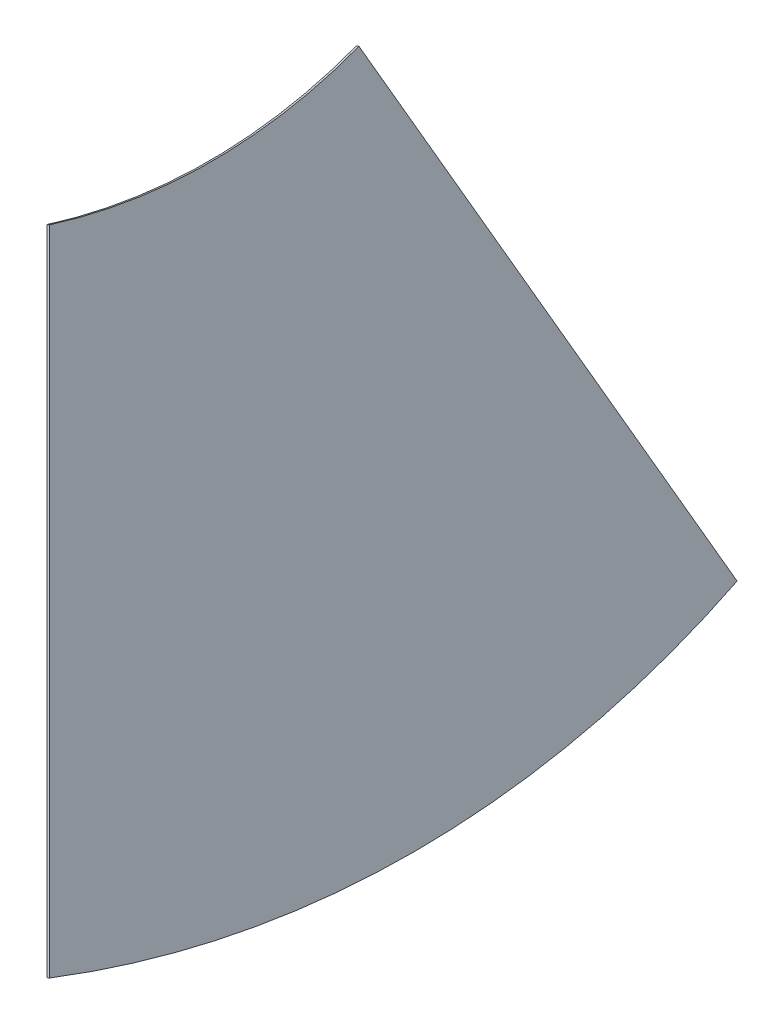
ISO-10303-21;
HEADER;
FILE_DESCRIPTION(('STEP AP214'),'2;1');
FILE_NAME('part.step','',(''),(''),'','','');
FILE_SCHEMA(('AUTOMOTIVE_DESIGN { 1 0 10303 214 1 1 1 1 }'));
ENDSEC;
DATA;
#1=APPLICATION_CONTEXT('core data for automotive mechanical design processes');
#2=APPLICATION_PROTOCOL_DEFINITION('international standard','automotive_design',2000,#1);
#3=PRODUCT_CONTEXT('',#1,'mechanical');
#4=PRODUCT('Part','Part','',(#3));
#5=PRODUCT_RELATED_PRODUCT_CATEGORY('part','',(#4));
#6=PRODUCT_DEFINITION_FORMATION('','',#4);
#7=PRODUCT_DEFINITION_CONTEXT('part definition',#1,'design');
#8=PRODUCT_DEFINITION('design','',#6,#7);
#9=PRODUCT_DEFINITION_SHAPE('','',#8);
#10=(LENGTH_UNIT() NAMED_UNIT(*) SI_UNIT(.MILLI.,.METRE.));
#11=(NAMED_UNIT(*) PLANE_ANGLE_UNIT() SI_UNIT($,.RADIAN.));
#12=(NAMED_UNIT(*) SI_UNIT($,.STERADIAN.) SOLID_ANGLE_UNIT());
#13=UNCERTAINTY_MEASURE_WITH_UNIT(LENGTH_MEASURE(1.E-05),#10,'distance_accuracy_value','');
#14=(GEOMETRIC_REPRESENTATION_CONTEXT(3) GLOBAL_UNCERTAINTY_ASSIGNED_CONTEXT((#13)) GLOBAL_UNIT_ASSIGNED_CONTEXT((#10,
#11,#12)) REPRESENTATION_CONTEXT('',''));
#15=CARTESIAN_POINT('',(0.,0.,0.));
#16=DIRECTION('',(0.,0.,1.));
#17=DIRECTION('',(1.,0.,0.));
#18=AXIS2_PLACEMENT_3D('',#15,#16,#17);
#19=CARTESIAN_POINT('',(67.6198105581934,-46.9334659405623,-66.5105974354039));
#20=DIRECTION('',(0.133630620956204,-0.327326835353981,0.935414346693489));
#21=DIRECTION('',(0.,-0.943879807448542,-0.3302891295379));
#22=AXIS2_PLACEMENT_3D('',#19,#20,#21);
#23=PLANE('',#22);
#24=DIRECTION('',(0.353553390593269,-0.866025403784445,-0.353553390593264));
#25=VECTOR('',#24,1.);
#26=CARTESIAN_POINT('',(68.7956020849046,-46.4534510598406,-66.5105974354039));
#27=LINE('',#26,#25);
#28=CARTESIAN_POINT('',(68.7956020849046,-46.4534510598406,-66.5105974354041));
#29=VERTEX_POINT('',#28);
#30=CARTESIAN_POINT('',(150.112881921356,-245.639293930263,-147.827877271854));
#31=VERTEX_POINT('',#30);
#32=EDGE_CURVE('E103',#29,#31,#27,.T.);
#33=ORIENTED_EDGE('',*,*,#32,.T.);
#34=DIRECTION('',(0.925820099772554,0.37796447300922,0.));
#35=VECTOR('',#34,1.);
#36=CARTESIAN_POINT('',(148.937090394645,-246.119308810984,-147.827877271854));
#37=LINE('',#36,#35);
#38=CARTESIAN_POINT('',(148.937090394645,-246.119308810984,-147.827877271854));
#39=VERTEX_POINT('',#38);
#40=EDGE_CURVE('E11',#39,#31,#37,.T.);
#41=ORIENTED_EDGE('',*,*,#40,.F.);
#42=DIRECTION('',(0.353553390593269,-0.866025403784445,-0.353553390593264));
#43=VECTOR('',#42,1.);
#44=CARTESIAN_POINT('',(67.6198105581934,-46.9334659405623,-66.5105974354039));
#45=LINE('',#44,#43);
#46=CARTESIAN_POINT('',(67.6198105581934,-46.9334659405623,-66.5105974354041));
#47=VERTEX_POINT('',#46);
#48=EDGE_CURVE('E80',#47,#39,#45,.T.);
#49=ORIENTED_EDGE('',*,*,#48,.F.);
#50=DIRECTION('',(0.925820099772554,0.37796447300922,0.));
#51=VECTOR('',#50,1.);
#52=CARTESIAN_POINT('',(67.6198105581934,-46.9334659405623,-66.5105974354041));
#53=LINE('',#52,#51);
#54=EDGE_CURVE('E55',#47,#29,#53,.T.);
#55=ORIENTED_EDGE('',*,*,#54,.T.);
#56=EDGE_LOOP('',(#33,#41,#49,#55));
#57=FACE_BOUND('',#56,.T.);
#58=ADVANCED_FACE('F39',(#57),#23,.F.);
#59=CARTESIAN_POINT('',(-18.1104032653215,163.061813466751,1.31737728695417E-12));
#60=DIRECTION('',(0.925820099772554,0.37796447300922,0.));
#61=DIRECTION('',(-0.37796447300922,0.925820099772555,0.));
#62=AXIS2_PLACEMENT_3D('',#59,#60,#61);
#63=CYLINDRICAL_SURFACE('',#62,466.033407885364);
#64=CARTESIAN_POINT('',(-16.9346117386104,163.541828347472,1.31940239653058E-12));
#65=DIRECTION('',(0.925820099772555,0.37796447300922,0.));
#66=DIRECTION('',(-0.37796447300922,0.925820099772555,0.));
#67=AXIS2_PLACEMENT_3D('',#64,#65,#66);
#68=CIRCLE('',#67,466.033407885364);
#69=CARTESIAN_POINT('',(150.112881921356,-245.639293930263,147.827877271855));
#70=VERTEX_POINT('',#69);
#71=EDGE_CURVE('E90',#70,#31,#68,.T.);
#72=ORIENTED_EDGE('',*,*,#71,.F.);
#73=DIRECTION('',(0.925820099772554,0.37796447300922,0.));
#74=VECTOR('',#73,1.);
#75=CARTESIAN_POINT('',(148.937090394645,-246.119308810984,147.827877271855));
#76=LINE('',#75,#74);
#77=CARTESIAN_POINT('',(148.937090394645,-246.119308810984,147.827877271855));
#78=VERTEX_POINT('',#77);
#79=EDGE_CURVE('E47',#78,#70,#76,.T.);
#80=ORIENTED_EDGE('',*,*,#79,.F.);
#81=CARTESIAN_POINT('',(-18.1104032653215,163.061813466751,1.31737728695417E-12));
#82=DIRECTION('',(0.925820099772555,0.37796447300922,0.));
#83=DIRECTION('',(-0.37796447300922,0.925820099772555,0.));
#84=AXIS2_PLACEMENT_3D('',#81,#82,#83);
#85=CIRCLE('',#84,466.033407885364);
#86=EDGE_CURVE('E88',#78,#39,#85,.T.);
#87=ORIENTED_EDGE('',*,*,#86,.T.);
#88=ORIENTED_EDGE('',*,*,#40,.T.);
#89=EDGE_LOOP('',(#72,#80,#87,#88));
#90=FACE_BOUND('',#89,.T.);
#91=ADVANCED_FACE('F87',(#90),#63,.T.);
#92=CARTESIAN_POINT('',(148.937090394645,-246.119308810984,147.827877271855));
#93=DIRECTION('',(0.133630620956208,-0.327326835353981,-0.935414346693488));
#94=DIRECTION('',(0.,0.943879807448542,-0.330289129537901));
#95=AXIS2_PLACEMENT_3D('',#92,#93,#94);
#96=PLANE('',#95);
#97=DIRECTION('',(-0.353553390593268,0.866025403784444,-0.353553390593265));
#98=VECTOR('',#97,1.);
#99=CARTESIAN_POINT('',(150.112881921356,-245.639293930263,147.827877271855));
#100=LINE('',#99,#98);
#101=CARTESIAN_POINT('',(68.7956020849043,-46.4534510598405,66.5105974354042));
#102=VERTEX_POINT('',#101);
#103=EDGE_CURVE('E106',#70,#102,#100,.T.);
#104=ORIENTED_EDGE('',*,*,#103,.T.);
#105=DIRECTION('',(0.925820099772554,0.37796447300922,0.));
#106=VECTOR('',#105,1.);
#107=CARTESIAN_POINT('',(67.6198105581932,-46.9334659405622,66.5105974354042));
#108=LINE('',#107,#106);
#109=CARTESIAN_POINT('',(67.6198105581932,-46.9334659405622,66.5105974354042));
#110=VERTEX_POINT('',#109);
#111=EDGE_CURVE('E69',#110,#102,#108,.T.);
#112=ORIENTED_EDGE('',*,*,#111,.F.);
#113=DIRECTION('',(-0.353553390593268,0.866025403784444,-0.353553390593265));
#114=VECTOR('',#113,1.);
#115=CARTESIAN_POINT('',(148.937090394645,-246.119308810984,147.827877271855));
#116=LINE('',#115,#114);
#117=EDGE_CURVE('E93',#78,#110,#116,.T.);
#118=ORIENTED_EDGE('',*,*,#117,.F.);
#119=ORIENTED_EDGE('',*,*,#79,.T.);
#120=EDGE_LOOP('',(#104,#112,#118,#119));
#121=FACE_BOUND('',#120,.T.);
#122=ADVANCED_FACE('F94',(#121),#96,.F.);
#123=CARTESIAN_POINT('',(-27.915701762116,187.079791559577,-2.50812735328866E-13));
#124=DIRECTION('',(0.925820099772554,0.37796447300922,0.));
#125=DIRECTION('',(-0.37796447300922,0.925820099772555,0.));
#126=AXIS2_PLACEMENT_3D('',#123,#124,#125);
#127=CYLINDRICAL_SURFACE('',#126,261.367362865651);
#128=CARTESIAN_POINT('',(-26.7399102354049,187.559806440299,-2.48787625752454E-13));
#129=DIRECTION('',(-0.925820099772555,-0.37796447300922,0.));
#130=DIRECTION('',(0.37796447300922,-0.925820099772555,0.));
#131=AXIS2_PLACEMENT_3D('',#128,#129,#130);
#132=CIRCLE('',#131,261.367362865651);
#133=EDGE_CURVE('E99',#29,#102,#132,.T.);
#134=ORIENTED_EDGE('',*,*,#133,.F.);
#135=ORIENTED_EDGE('',*,*,#54,.F.);
#136=CARTESIAN_POINT('',(-27.915701762116,187.079791559577,-2.50812735328866E-13));
#137=DIRECTION('',(-0.925820099772555,-0.37796447300922,0.));
#138=DIRECTION('',(0.37796447300922,-0.925820099772555,0.));
#139=AXIS2_PLACEMENT_3D('',#136,#137,#138);
#140=CIRCLE('',#139,261.367362865651);
#141=EDGE_CURVE('E95',#47,#110,#140,.T.);
#142=ORIENTED_EDGE('',*,*,#141,.T.);
#143=ORIENTED_EDGE('',*,*,#111,.T.);
#144=EDGE_LOOP('',(#134,#135,#142,#143));
#145=FACE_BOUND('',#144,.T.);
#146=ADVANCED_FACE('F113',(#145),#127,.F.);
#147=CARTESIAN_POINT('',(-18.1104032653215,163.061813466751,1.31737728695417E-12));
#148=DIRECTION('',(0.925820099772555,0.37796447300922,0.));
#149=DIRECTION('',(-0.37796447300922,0.925820099772555,0.));
#150=AXIS2_PLACEMENT_3D('',#147,#148,#149);
#151=PLANE('',#150);
#152=ORIENTED_EDGE('',*,*,#48,.T.);
#153=ORIENTED_EDGE('',*,*,#86,.F.);
#154=ORIENTED_EDGE('',*,*,#117,.T.);
#155=ORIENTED_EDGE('',*,*,#141,.F.);
#156=EDGE_LOOP('',(#152,#153,#154,#155));
#157=FACE_BOUND('',#156,.T.);
#158=ADVANCED_FACE('F97',(#157),#151,.F.);
#159=CARTESIAN_POINT('',(-16.9346117386104,163.541828347472,1.31940239653058E-12));
#160=DIRECTION('',(0.925820099772555,0.37796447300922,0.));
#161=DIRECTION('',(-0.37796447300922,0.925820099772555,0.));
#162=AXIS2_PLACEMENT_3D('',#159,#160,#161);
#163=PLANE('',#162);
#164=ORIENTED_EDGE('',*,*,#32,.F.);
#165=ORIENTED_EDGE('',*,*,#133,.T.);
#166=ORIENTED_EDGE('',*,*,#103,.F.);
#167=ORIENTED_EDGE('',*,*,#71,.T.);
#168=EDGE_LOOP('',(#164,#165,#166,#167));
#169=FACE_BOUND('',#168,.T.);
#170=ADVANCED_FACE('F112',(#169),#163,.T.);
#171=CLOSED_SHELL('',(#58,#91,#122,#146,#158,#170));
#172=MANIFOLD_SOLID_BREP('B2',#171);
#173=ADVANCED_BREP_SHAPE_REPRESENTATION('',(#18,#172),#14);
#174=SHAPE_DEFINITION_REPRESENTATION(#9,#173);
ENDSEC;
END-ISO-10303-21;
